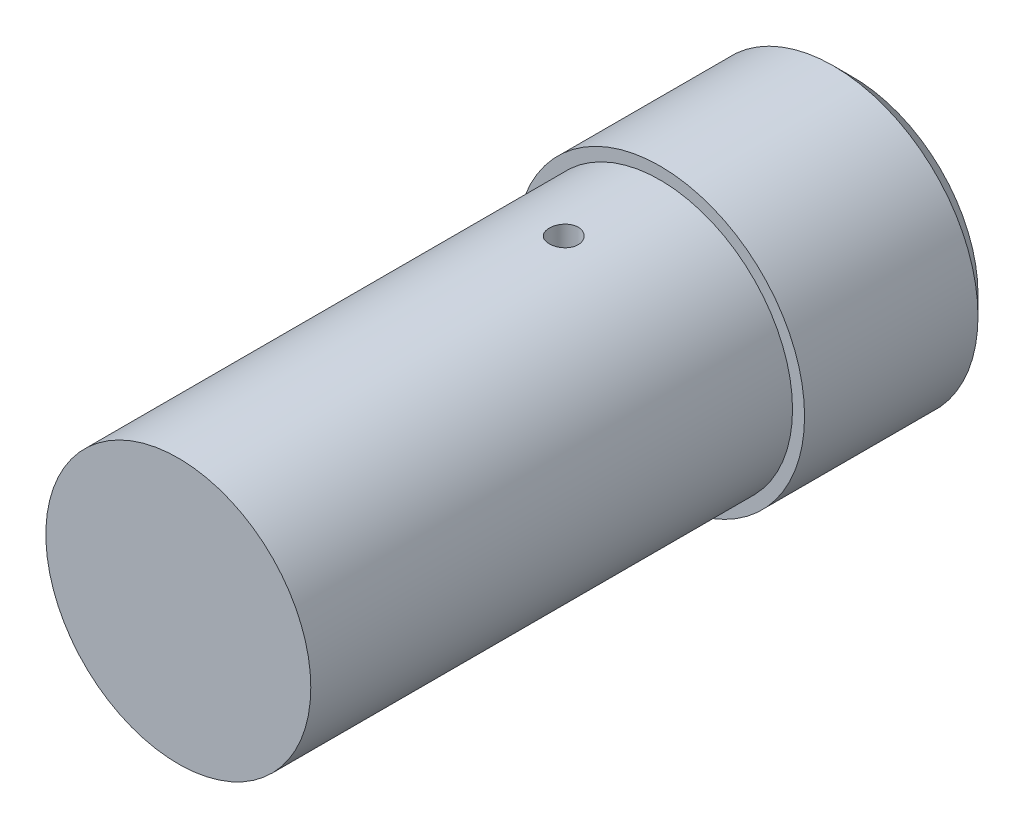
ISO-10303-21;
HEADER;
FILE_DESCRIPTION(('STEP AP214'),'2;1');
FILE_NAME('part.step','',(''),(''),'','','');
FILE_SCHEMA(('AUTOMOTIVE_DESIGN { 1 0 10303 214 1 1 1 1 }'));
ENDSEC;
DATA;
#1=APPLICATION_CONTEXT('core data for automotive mechanical design processes');
#2=APPLICATION_PROTOCOL_DEFINITION('international standard','automotive_design',2000,#1);
#3=PRODUCT_CONTEXT('',#1,'mechanical');
#4=PRODUCT('Part','Part','',(#3));
#5=PRODUCT_RELATED_PRODUCT_CATEGORY('part','',(#4));
#6=PRODUCT_DEFINITION_FORMATION('','',#4);
#7=PRODUCT_DEFINITION_CONTEXT('part definition',#1,'design');
#8=PRODUCT_DEFINITION('design','',#6,#7);
#9=PRODUCT_DEFINITION_SHAPE('','',#8);
#10=(LENGTH_UNIT() NAMED_UNIT(*) SI_UNIT(.MILLI.,.METRE.));
#11=(NAMED_UNIT(*) PLANE_ANGLE_UNIT() SI_UNIT($,.RADIAN.));
#12=(NAMED_UNIT(*) SI_UNIT($,.STERADIAN.) SOLID_ANGLE_UNIT());
#13=UNCERTAINTY_MEASURE_WITH_UNIT(LENGTH_MEASURE(1.E-05),#10,'distance_accuracy_value','');
#14=(GEOMETRIC_REPRESENTATION_CONTEXT(3) GLOBAL_UNCERTAINTY_ASSIGNED_CONTEXT((#13)) GLOBAL_UNIT_ASSIGNED_CONTEXT((#10,
#11,#12)) REPRESENTATION_CONTEXT('',''));
#15=CARTESIAN_POINT('',(0.,0.,0.));
#16=DIRECTION('',(0.,0.,1.));
#17=DIRECTION('',(1.,0.,0.));
#18=AXIS2_PLACEMENT_3D('',#15,#16,#17);
#19=CARTESIAN_POINT('',(0.,0.,40.));
#20=DIRECTION('',(0.,0.,1.));
#21=DIRECTION('',(1.,0.,0.));
#22=AXIS2_PLACEMENT_3D('',#19,#20,#21);
#23=PLANE('',#22);
#24=CARTESIAN_POINT('',(0.,0.,40.));
#25=DIRECTION('',(0.,0.,1.));
#26=DIRECTION('',(1.,0.,0.));
#27=AXIS2_PLACEMENT_3D('',#24,#25,#26);
#28=CIRCLE('',#27,30.);
#29=CARTESIAN_POINT('',(30.,0.,40.));
#30=VERTEX_POINT('',#29);
#31=EDGE_CURVE('E43',#30,#30,#28,.T.);
#32=ORIENTED_EDGE('',*,*,#31,.T.);
#33=EDGE_LOOP('',(#32));
#34=FACE_BOUND('',#33,.T.);
#35=CARTESIAN_POINT('',(0.,0.,40.));
#36=DIRECTION('',(0.,0.,1.));
#37=DIRECTION('',(1.,0.,0.));
#38=AXIS2_PLACEMENT_3D('',#35,#36,#37);
#39=CIRCLE('',#38,27.5);
#40=CARTESIAN_POINT('',(27.5,0.,40.));
#41=VERTEX_POINT('',#40);
#42=EDGE_CURVE('E56',#41,#41,#39,.T.);
#43=ORIENTED_EDGE('',*,*,#42,.F.);
#44=EDGE_LOOP('',(#43));
#45=FACE_BOUND('',#44,.T.);
#46=ADVANCED_FACE('F32',(#34,#45),#23,.T.);
#47=CARTESIAN_POINT('',(0.,0.,40.));
#48=DIRECTION('',(0.,0.,-1.));
#49=DIRECTION('',(-1.,0.,0.));
#50=AXIS2_PLACEMENT_3D('',#47,#48,#49);
#51=CYLINDRICAL_SURFACE('',#50,30.);
#52=CARTESIAN_POINT('',(0.,0.,4.00000000000007));
#53=DIRECTION('',(0.,0.,1.));
#54=DIRECTION('',(1.,0.,0.));
#55=AXIS2_PLACEMENT_3D('',#52,#53,#54);
#56=CIRCLE('',#55,30.);
#57=CARTESIAN_POINT('',(30.,0.,4.00000000000007));
#58=VERTEX_POINT('',#57);
#59=EDGE_CURVE('E39',#58,#58,#56,.T.);
#60=ORIENTED_EDGE('',*,*,#59,.T.);
#61=EDGE_LOOP('',(#60));
#62=FACE_BOUND('',#61,.T.);
#63=ORIENTED_EDGE('',*,*,#31,.F.);
#64=EDGE_LOOP('',(#63));
#65=FACE_BOUND('',#64,.T.);
#66=ADVANCED_FACE('F79',(#62,#65),#51,.T.);
#67=CARTESIAN_POINT('',(0.,0.,0.));
#68=DIRECTION('',(0.,0.,1.));
#69=DIRECTION('',(1.,0.,0.));
#70=AXIS2_PLACEMENT_3D('',#67,#68,#69);
#71=PLANE('',#70);
#72=CARTESIAN_POINT('',(0.,0.,0.));
#73=DIRECTION('',(0.,0.,1.));
#74=DIRECTION('',(1.,0.,0.));
#75=AXIS2_PLACEMENT_3D('',#72,#73,#74);
#76=CIRCLE('',#75,26.);
#77=CARTESIAN_POINT('',(26.,0.,0.));
#78=VERTEX_POINT('',#77);
#79=EDGE_CURVE('E10',#78,#78,#76,.F.);
#80=ORIENTED_EDGE('',*,*,#79,.T.);
#81=EDGE_LOOP('',(#80));
#82=FACE_BOUND('',#81,.T.);
#83=ADVANCED_FACE('F75',(#82),#71,.F.);
#84=CARTESIAN_POINT('',(0.,0.,140.));
#85=DIRECTION('',(0.,0.,-1.));
#86=DIRECTION('',(-1.,0.,0.));
#87=AXIS2_PLACEMENT_3D('',#84,#85,#86);
#88=CYLINDRICAL_SURFACE('',#87,27.5);
#89=CARTESIAN_POINT('',(0.,27.5,63.));
#90=CARTESIAN_POINT('',(-0.167975868376869,27.4999979116598,62.9999927692906));
#91=CARTESIAN_POINT('',(-0.336060738494639,27.4984446310749,62.9858445307435));
#92=CARTESIAN_POINT('',(-0.667564671830644,27.492397662926,62.9296213115804));
#93=CARTESIAN_POINT('',(-0.83097848549194,27.4879007931067,62.88751610654));
#94=CARTESIAN_POINT('',(-1.14829223856382,27.4764739181941,62.7766243777015));
#95=CARTESIAN_POINT('',(-1.30219807746918,27.4695454400617,62.7078545954453));
#96=CARTESIAN_POINT('',(-1.59625097740713,27.4540286703792,62.5456197858665));
#97=CARTESIAN_POINT('',(-1.73640063975116,27.445440693558,62.4521594399503));
#98=CARTESIAN_POINT('',(-1.99958990111048,27.4275251015521,62.2427713442331));
#99=CARTESIAN_POINT('',(-2.12256280788388,27.4181948127344,62.1267599866509));
#100=CARTESIAN_POINT('',(-2.34733416063553,27.3998680965195,61.8757418673102));
#101=CARTESIAN_POINT('',(-2.44913159477986,27.3908716850927,61.7407341983616));
#102=CARTESIAN_POINT('',(-2.62890315408081,27.374204442849,61.4551323920509));
#103=CARTESIAN_POINT('',(-2.70681613494178,27.3665370357147,61.304499550562));
#104=CARTESIAN_POINT('',(-2.8362166999047,27.353429950994,60.9921908926487));
#105=CARTESIAN_POINT('',(-2.88770505395436,27.3479902085,60.8305153981352));
#106=CARTESIAN_POINT('',(-2.96259521296343,27.3399790963686,60.5013957265756));
#107=CARTESIAN_POINT('',(-2.98610841677877,27.3373963528846,60.3339771795491));
#108=CARTESIAN_POINT('',(-3.00472529781197,27.3353565635502,59.9975517094242));
#109=CARTESIAN_POINT('',(-2.99982985509055,27.3358994208729,59.8285448356918));
#110=CARTESIAN_POINT('',(-2.96186009323341,27.3400390992253,59.4945109446213));
#111=CARTESIAN_POINT('',(-2.92890776758895,27.3436226986425,59.3294698732605));
#112=CARTESIAN_POINT('',(-2.83594963113794,27.353419444555,59.0072745323142));
#113=CARTESIAN_POINT('',(-2.77594339261966,27.3596326326229,58.8501203874616));
#114=CARTESIAN_POINT('',(-2.6304473288821,27.374003636826,58.5477767137246));
#115=CARTESIAN_POINT('',(-2.54490375615039,27.3821655470399,58.4026132521349));
#116=CARTESIAN_POINT('',(-2.35079985165565,27.3995110082287,58.1286569825677));
#117=CARTESIAN_POINT('',(-2.24223871768391,27.4086945948058,57.9998647454109));
#118=CARTESIAN_POINT('',(-2.00450176105454,27.4271075361175,57.761598234513));
#119=CARTESIAN_POINT('',(-1.87522065017508,27.4363368778735,57.6522289865134));
#120=CARTESIAN_POINT('',(-1.6000781096827,27.4537560218664,57.4567283301999));
#121=CARTESIAN_POINT('',(-1.45421665568968,27.4619458225745,57.3705969560561));
#122=CARTESIAN_POINT('',(-1.14997834994771,27.4763665683382,57.2240197667446));
#123=CARTESIAN_POINT('',(-0.991598705747729,27.4825970747792,57.1635797018617));
#124=CARTESIAN_POINT('',(-0.666856011151024,27.4923929475682,57.0701799326867));
#125=CARTESIAN_POINT('',(-0.500493245264941,27.495958408821,57.0372192498245));
#126=CARTESIAN_POINT('',(-0.165415775077812,27.5000102249267,56.9998480896986));
#127=CARTESIAN_POINT('',(0.00328259378899336,27.5005122005932,56.9952927699622));
#128=CARTESIAN_POINT('',(0.339040333226887,27.4984224710322,57.0144806054715));
#129=CARTESIAN_POINT('',(0.506099730189012,27.4958308157017,57.0382233043007));
#130=CARTESIAN_POINT('',(0.833416111121749,27.4878549228007,57.1132129851893));
#131=CARTESIAN_POINT('',(0.993688912425678,27.4824776149554,57.1643917269622));
#132=CARTESIAN_POINT('',(1.30337528323638,27.4695332316745,57.2927303128885));
#133=CARTESIAN_POINT('',(1.45278856583254,27.4619660984096,57.3698908431827));
#134=CARTESIAN_POINT('',(1.73716679093736,27.4454485681995,57.5483589400939));
#135=CARTESIAN_POINT('',(1.87207200545017,27.4364927978454,57.6497611741919));
#136=CARTESIAN_POINT('',(2.12299899180769,27.4182190120258,57.8736991211965));
#137=CARTESIAN_POINT('',(2.23902019734443,27.4089009857071,57.996235467662));
#138=CARTESIAN_POINT('',(2.44939239701704,27.3909054722623,58.2595973545751));
#139=CARTESIAN_POINT('',(2.54364800301497,27.3822309136842,58.4004993192366));
#140=CARTESIAN_POINT('',(2.70715660430708,27.3665503604857,58.6962178878254));
#141=CARTESIAN_POINT('',(2.77640999691705,27.3595443393508,58.8510342705868));
#142=CARTESIAN_POINT('',(2.8877903997753,27.348013034268,59.1698664414803));
#143=CARTESIAN_POINT('',(2.92997315592063,27.3434826551684,59.3338625634199));
#144=CARTESIAN_POINT('',(2.98619531629785,27.3374002077004,59.6666622700653));
#145=CARTESIAN_POINT('',(3.00023569571269,27.3358480361318,59.8354656879843));
#146=CARTESIAN_POINT('',(2.99975954834459,27.3359002173548,60.1721399396287));
#147=CARTESIAN_POINT('',(2.98539286111483,27.3374880077071,60.3400110078068));
#148=CARTESIAN_POINT('',(2.92882562987497,27.3436057970592,60.6709388627792));
#149=CARTESIAN_POINT('',(2.8866250630155,27.3481357984742,60.8339956456213));
#150=CARTESIAN_POINT('',(2.77563125868385,27.3596228227355,61.1506588200027));
#151=CARTESIAN_POINT('',(2.70684339576581,27.366579355037,61.30426711426));
#152=CARTESIAN_POINT('',(2.54464271593913,27.3821365537538,61.5977827851346));
#153=CARTESIAN_POINT('',(2.45122988441464,27.3907372211448,61.7376901536198));
#154=CARTESIAN_POINT('',(2.24187003837895,27.4086680044904,62.0006000763477));
#155=CARTESIAN_POINT('',(2.12581126253718,27.4180015951168,62.123513399711));
#156=CARTESIAN_POINT('',(1.87468089688407,27.4363151216808,62.3481823057469));
#157=CARTESIAN_POINT('',(1.73960478551519,27.4452949728617,62.4499328424659));
#158=CARTESIAN_POINT('',(1.45383048196123,27.4619174065639,62.6296312627077));
#159=CARTESIAN_POINT('',(1.30308750755164,27.4695559779424,62.707508252626));
#160=CARTESIAN_POINT('',(0.990672870504218,27.4825928750271,62.836737722382));
#161=CARTESIAN_POINT('',(0.829013607824406,27.4879936944518,62.8881197435338));
#162=CARTESIAN_POINT('',(0.555387330509397,27.494608022763,62.9502608196332));
#163=CARTESIAN_POINT('',(0.445162015893081,27.4966204440128,62.9688870860802));
#164=CARTESIAN_POINT('',(0.223307189579797,27.4993171234277,62.9937590480901));
#165=CARTESIAN_POINT('',(0.111677685103583,27.5000013884196,63.000004807291));
#166=CARTESIAN_POINT('',(0.,27.5,63.));
#167=B_SPLINE_CURVE_WITH_KNOTS('',3,(#89,#90,#91,#92,#93,#94,#95,#96,#97,#98,#99,#100,#101,#102,
#103,#104,#105,#106,#107,#108,#109,#110,#111,#112,#113,#114,#115,#116,#117,#118,#119,#120,#121,
#122,#123,#124,#125,#126,#127,#128,#129,#130,#131,#132,#133,#134,#135,#136,#137,#138,#139,#140,
#141,#142,#143,#144,#145,#146,#147,#148,#149,#150,#151,#152,#153,#154,#155,#156,#157,#158,#159,
#160,#161,#162,#163,#164,#165,#166),.UNSPECIFIED.,.T.,.F.,(4,2,2,2,2,2,2,2,2,2,2,2,2,2,2,2,2,2,
2,2,2,2,2,2,2,2,2,2,2,2,2,2,2,2,2,2,2,2,4),(0.,0.503519761039182,1.00758476822716,
1.51133380580219,2.01498739948662,2.52054518318071,3.02612711854686,3.53299274046388,
4.03984359274226,4.5446693039396,5.04947937641551,5.55210563949436,6.05473984917568,
6.55843948401268,7.06215667669079,7.56851976384217,8.07488359557108,8.58136070315511,
9.08781977377727,9.59169422059372,10.0955605405677,10.5981793947059,11.1008115233097,
11.6054395257539,12.1100826585777,12.6168971147872,13.1237035167395,13.6294628870803,
14.1352047316645,14.6382860414229,15.1413677641712,15.6443478433747,16.1473282211165,
16.6528567100274,17.1585055969004,17.6656418025492,18.1722113329988,18.5069749565144,
18.8417368592814),.UNSPECIFIED.);
#168=CARTESIAN_POINT('',(0.,27.5,63.));
#169=VERTEX_POINT('',#168);
#170=EDGE_CURVE('E50',#169,#169,#167,.T.);
#171=ORIENTED_EDGE('',*,*,#170,.T.);
#172=EDGE_LOOP('',(#171));
#173=FACE_BOUND('',#172,.T.);
#174=CARTESIAN_POINT('',(0.,0.,140.));
#175=DIRECTION('',(0.,0.,1.));
#176=DIRECTION('',(1.,0.,0.));
#177=AXIS2_PLACEMENT_3D('',#174,#175,#176);
#178=CIRCLE('',#177,27.5);
#179=CARTESIAN_POINT('',(27.5,0.,140.));
#180=VERTEX_POINT('',#179);
#181=EDGE_CURVE('E47',#180,#180,#178,.T.);
#182=ORIENTED_EDGE('',*,*,#181,.F.);
#183=EDGE_LOOP('',(#182));
#184=FACE_BOUND('',#183,.T.);
#185=ORIENTED_EDGE('',*,*,#42,.T.);
#186=EDGE_LOOP('',(#185));
#187=FACE_BOUND('',#186,.T.);
#188=ADVANCED_FACE('F59',(#173,#184,#187),#88,.T.);
#189=CARTESIAN_POINT('',(0.,0.,140.));
#190=DIRECTION('',(0.,0.,1.));
#191=DIRECTION('',(1.,0.,0.));
#192=AXIS2_PLACEMENT_3D('',#189,#190,#191);
#193=PLANE('',#192);
#194=ORIENTED_EDGE('',*,*,#181,.T.);
#195=EDGE_LOOP('',(#194));
#196=FACE_BOUND('',#195,.T.);
#197=ADVANCED_FACE('F68',(#196),#193,.T.);
#198=CARTESIAN_POINT('',(0.,0.,60.));
#199=DIRECTION('',(0.,1.,0.));
#200=DIRECTION('',(0.,0.,1.));
#201=AXIS2_PLACEMENT_3D('',#198,#199,#200);
#202=CYLINDRICAL_SURFACE('',#201,3.);
#203=CARTESIAN_POINT('',(0.,0.,60.));
#204=DIRECTION('',(0.,1.,0.));
#205=DIRECTION('',(0.,0.,1.));
#206=AXIS2_PLACEMENT_3D('',#203,#204,#205);
#207=CIRCLE('',#206,3.);
#208=CARTESIAN_POINT('',(0.,0.,63.));
#209=VERTEX_POINT('',#208);
#210=EDGE_CURVE('E57',#209,#209,#207,.T.);
#211=ORIENTED_EDGE('',*,*,#210,.F.);
#212=EDGE_LOOP('',(#211));
#213=FACE_BOUND('',#212,.T.);
#214=ORIENTED_EDGE('',*,*,#170,.F.);
#215=EDGE_LOOP('',(#214));
#216=FACE_BOUND('',#215,.T.);
#217=ADVANCED_FACE('F63',(#213,#216),#202,.F.);
#218=CARTESIAN_POINT('',(0.,0.,60.));
#219=DIRECTION('',(0.,1.,0.));
#220=DIRECTION('',(0.,0.,1.));
#221=AXIS2_PLACEMENT_3D('',#218,#219,#220);
#222=PLANE('',#221);
#223=ORIENTED_EDGE('',*,*,#210,.T.);
#224=EDGE_LOOP('',(#223));
#225=FACE_BOUND('',#224,.T.);
#226=ADVANCED_FACE('F67',(#225),#222,.T.);
#227=CARTESIAN_POINT('',(0.,0.,4.00000000000007));
#228=DIRECTION('',(0.,0.,1.));
#229=DIRECTION('',(1.,0.,0.));
#230=AXIS2_PLACEMENT_3D('',#227,#228,#229);
#231=CONICAL_SURFACE('',#230,30.,0.785398163397443);
#232=ORIENTED_EDGE('',*,*,#79,.F.);
#233=EDGE_LOOP('',(#232));
#234=FACE_BOUND('',#233,.T.);
#235=ORIENTED_EDGE('',*,*,#59,.F.);
#236=EDGE_LOOP('',(#235));
#237=FACE_BOUND('',#236,.T.);
#238=ADVANCED_FACE('F34',(#234,#237),#231,.T.);
#239=CLOSED_SHELL('',(#46,#66,#83,#188,#197,#217,#226,#238));
#240=MANIFOLD_SOLID_BREP('B2',#239);
#241=ADVANCED_BREP_SHAPE_REPRESENTATION('',(#18,#240),#14);
#242=SHAPE_DEFINITION_REPRESENTATION(#9,#241);
ENDSEC;
END-ISO-10303-21;
